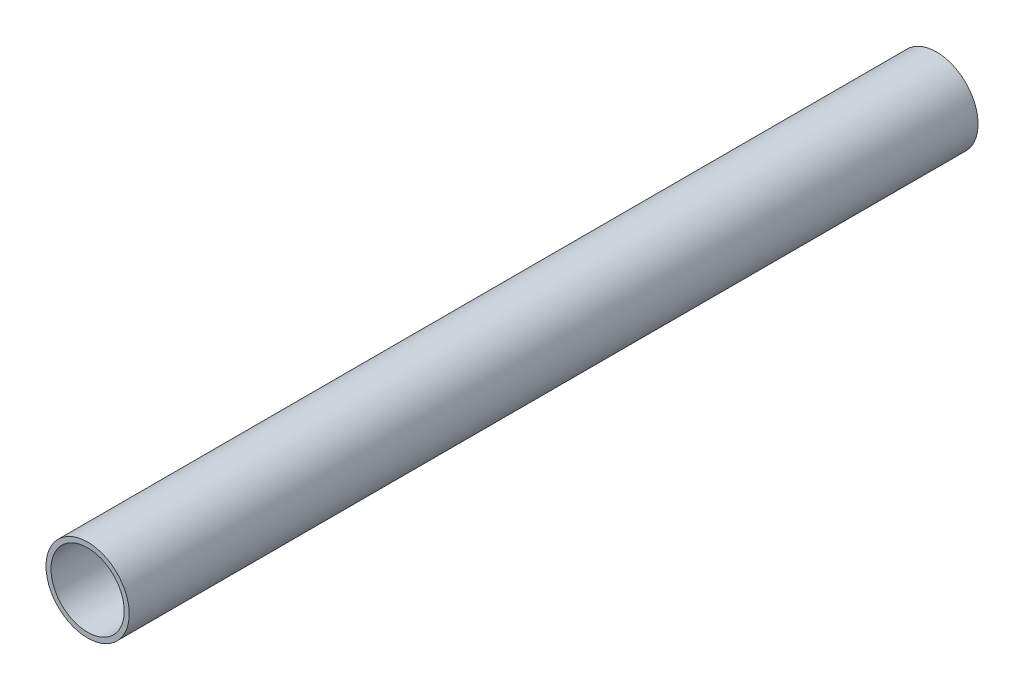
ISO-10303-21;
HEADER;
FILE_DESCRIPTION(('STEP AP214'),'2;1');
FILE_NAME('part.step','',(''),(''),'','','');
FILE_SCHEMA(('AUTOMOTIVE_DESIGN { 1 0 10303 214 1 1 1 1 }'));
ENDSEC;
DATA;
#1=APPLICATION_CONTEXT('core data for automotive mechanical design processes');
#2=APPLICATION_PROTOCOL_DEFINITION('international standard','automotive_design',2000,#1);
#3=PRODUCT_CONTEXT('',#1,'mechanical');
#4=PRODUCT('Part','Part','',(#3));
#5=PRODUCT_RELATED_PRODUCT_CATEGORY('part','',(#4));
#6=PRODUCT_DEFINITION_FORMATION('','',#4);
#7=PRODUCT_DEFINITION_CONTEXT('part definition',#1,'design');
#8=PRODUCT_DEFINITION('design','',#6,#7);
#9=PRODUCT_DEFINITION_SHAPE('','',#8);
#10=(LENGTH_UNIT() NAMED_UNIT(*) SI_UNIT(.MILLI.,.METRE.));
#11=(NAMED_UNIT(*) PLANE_ANGLE_UNIT() SI_UNIT($,.RADIAN.));
#12=(NAMED_UNIT(*) SI_UNIT($,.STERADIAN.) SOLID_ANGLE_UNIT());
#13=UNCERTAINTY_MEASURE_WITH_UNIT(LENGTH_MEASURE(1.E-05),#10,'distance_accuracy_value','');
#14=(GEOMETRIC_REPRESENTATION_CONTEXT(3) GLOBAL_UNCERTAINTY_ASSIGNED_CONTEXT((#13)) GLOBAL_UNIT_ASSIGNED_CONTEXT((#10,
#11,#12)) REPRESENTATION_CONTEXT('',''));
#15=CARTESIAN_POINT('',(0.,0.,0.));
#16=DIRECTION('',(0.,0.,1.));
#17=DIRECTION('',(1.,0.,0.));
#18=AXIS2_PLACEMENT_3D('',#15,#16,#17);
#19=CARTESIAN_POINT('',(0.,0.,235.43));
#20=DIRECTION('',(0.,0.,-1.));
#21=DIRECTION('',(-1.,0.,0.));
#22=AXIS2_PLACEMENT_3D('',#19,#20,#21);
#23=CYLINDRICAL_SURFACE('',#22,12.5);
#24=CARTESIAN_POINT('',(0.,0.,235.43));
#25=DIRECTION('',(0.,0.,1.));
#26=DIRECTION('',(1.,0.,0.));
#27=AXIS2_PLACEMENT_3D('',#24,#25,#26);
#28=CIRCLE('',#27,12.5);
#29=CARTESIAN_POINT('',(12.5,0.,235.43));
#30=VERTEX_POINT('',#29);
#31=EDGE_CURVE('E10',#30,#30,#28,.T.);
#32=ORIENTED_EDGE('',*,*,#31,.F.);
#33=EDGE_LOOP('',(#32));
#34=FACE_BOUND('',#33,.T.);
#35=CARTESIAN_POINT('',(0.,0.,-19.57));
#36=DIRECTION('',(0.,0.,-1.));
#37=DIRECTION('',(-1.,0.,0.));
#38=AXIS2_PLACEMENT_3D('',#35,#36,#37);
#39=CIRCLE('',#38,12.5);
#40=CARTESIAN_POINT('',(-12.5,0.,-19.57));
#41=VERTEX_POINT('',#40);
#42=EDGE_CURVE('E42',#41,#41,#39,.T.);
#43=ORIENTED_EDGE('',*,*,#42,.F.);
#44=EDGE_LOOP('',(#43));
#45=FACE_BOUND('',#44,.T.);
#46=ADVANCED_FACE('F36',(#34,#45),#23,.T.);
#47=CARTESIAN_POINT('',(0.,0.,235.43));
#48=DIRECTION('',(0.,0.,1.));
#49=DIRECTION('',(1.,0.,0.));
#50=AXIS2_PLACEMENT_3D('',#47,#48,#49);
#51=PLANE('',#50);
#52=CARTESIAN_POINT('',(0.,0.,235.43));
#53=DIRECTION('',(0.,0.,1.));
#54=DIRECTION('',(1.,0.,0.));
#55=AXIS2_PLACEMENT_3D('',#52,#53,#54);
#56=CIRCLE('',#55,11.);
#57=CARTESIAN_POINT('',(-11.,0.,235.43));
#58=VERTEX_POINT('',#57);
#59=EDGE_CURVE('E46',#58,#58,#56,.T.);
#60=ORIENTED_EDGE('',*,*,#59,.F.);
#61=EDGE_LOOP('',(#60));
#62=FACE_BOUND('',#61,.T.);
#63=ORIENTED_EDGE('',*,*,#31,.T.);
#64=EDGE_LOOP('',(#63));
#65=FACE_BOUND('',#64,.T.);
#66=ADVANCED_FACE('F60',(#62,#65),#51,.T.);
#67=CARTESIAN_POINT('',(1.22546035237292,2.32941642090623,-19.57));
#68=DIRECTION('',(0.,0.,-1.));
#69=DIRECTION('',(-1.,0.,0.));
#70=AXIS2_PLACEMENT_3D('',#67,#68,#69);
#71=PLANE('',#70);
#72=CARTESIAN_POINT('',(0.,0.,-19.57));
#73=DIRECTION('',(0.,0.,-1.));
#74=DIRECTION('',(-1.,0.,0.));
#75=AXIS2_PLACEMENT_3D('',#72,#73,#74);
#76=CIRCLE('',#75,11.);
#77=CARTESIAN_POINT('',(-11.,0.,-19.57));
#78=VERTEX_POINT('',#77);
#79=EDGE_CURVE('E50',#78,#78,#76,.T.);
#80=ORIENTED_EDGE('',*,*,#79,.F.);
#81=EDGE_LOOP('',(#80));
#82=FACE_BOUND('',#81,.T.);
#83=ORIENTED_EDGE('',*,*,#42,.T.);
#84=EDGE_LOOP('',(#83));
#85=FACE_BOUND('',#84,.T.);
#86=ADVANCED_FACE('F58',(#82,#85),#71,.T.);
#87=CARTESIAN_POINT('',(0.,0.,318.43));
#88=DIRECTION('',(0.,0.,-1.));
#89=DIRECTION('',(-1.,0.,0.));
#90=AXIS2_PLACEMENT_3D('',#87,#88,#89);
#91=CYLINDRICAL_SURFACE('',#90,11.);
#92=CARTESIAN_POINT('',(-11.,0.,235.43));
#93=CARTESIAN_POINT('',(-11.,0.,232.77375));
#94=CARTESIAN_POINT('',(-11.,0.,230.1175));
#95=CARTESIAN_POINT('',(-11.,0.,224.805));
#96=CARTESIAN_POINT('',(-11.,0.,222.14875));
#97=CARTESIAN_POINT('',(-11.,0.,216.83625));
#98=CARTESIAN_POINT('',(-11.,0.,214.18));
#99=CARTESIAN_POINT('',(-11.,0.,208.8675));
#100=CARTESIAN_POINT('',(-11.,0.,206.21125));
#101=CARTESIAN_POINT('',(-11.,0.,200.89875));
#102=CARTESIAN_POINT('',(-11.,0.,198.2425));
#103=CARTESIAN_POINT('',(-11.,0.,192.93));
#104=CARTESIAN_POINT('',(-11.,0.,190.27375));
#105=CARTESIAN_POINT('',(-11.,0.,184.96125));
#106=CARTESIAN_POINT('',(-11.,0.,182.305));
#107=CARTESIAN_POINT('',(-11.,0.,176.9925));
#108=CARTESIAN_POINT('',(-11.,0.,174.33625));
#109=CARTESIAN_POINT('',(-11.,0.,169.02375));
#110=CARTESIAN_POINT('',(-11.,0.,166.3675));
#111=CARTESIAN_POINT('',(-11.,0.,161.055));
#112=CARTESIAN_POINT('',(-11.,0.,158.39875));
#113=CARTESIAN_POINT('',(-11.,0.,153.08625));
#114=CARTESIAN_POINT('',(-11.,0.,150.43));
#115=CARTESIAN_POINT('',(-11.,0.,145.1175));
#116=CARTESIAN_POINT('',(-11.,0.,142.46125));
#117=CARTESIAN_POINT('',(-11.,0.,137.14875));
#118=CARTESIAN_POINT('',(-11.,0.,134.4925));
#119=CARTESIAN_POINT('',(-11.,0.,129.18));
#120=CARTESIAN_POINT('',(-11.,0.,126.52375));
#121=CARTESIAN_POINT('',(-11.,0.,121.21125));
#122=CARTESIAN_POINT('',(-11.,0.,118.555));
#123=CARTESIAN_POINT('',(-11.,0.,113.2425));
#124=CARTESIAN_POINT('',(-11.,0.,110.58625));
#125=CARTESIAN_POINT('',(-11.,0.,105.27375));
#126=CARTESIAN_POINT('',(-11.,0.,102.6175));
#127=CARTESIAN_POINT('',(-11.,0.,97.305));
#128=CARTESIAN_POINT('',(-11.,0.,94.64875));
#129=CARTESIAN_POINT('',(-11.,0.,89.33625));
#130=CARTESIAN_POINT('',(-11.,0.,86.68));
#131=CARTESIAN_POINT('',(-11.,0.,81.3674999999999));
#132=CARTESIAN_POINT('',(-11.,0.,78.7112499999999));
#133=CARTESIAN_POINT('',(-11.,0.,73.3987499999999));
#134=CARTESIAN_POINT('',(-11.,0.,70.7425));
#135=CARTESIAN_POINT('',(-11.,0.,65.43));
#136=CARTESIAN_POINT('',(-11.,0.,62.77375));
#137=CARTESIAN_POINT('',(-11.,0.,57.46125));
#138=CARTESIAN_POINT('',(-11.,0.,54.805));
#139=CARTESIAN_POINT('',(-11.,0.,49.4925));
#140=CARTESIAN_POINT('',(-11.,0.,46.83625));
#141=CARTESIAN_POINT('',(-11.,0.,41.52375));
#142=CARTESIAN_POINT('',(-11.,0.,38.8675));
#143=CARTESIAN_POINT('',(-11.,0.,33.555));
#144=CARTESIAN_POINT('',(-11.,0.,30.89875));
#145=CARTESIAN_POINT('',(-11.,0.,25.58625));
#146=CARTESIAN_POINT('',(-11.,0.,22.93));
#147=CARTESIAN_POINT('',(-11.,0.,17.6175));
#148=CARTESIAN_POINT('',(-11.,0.,14.96125));
#149=CARTESIAN_POINT('',(-11.,0.,9.64874999999996));
#150=CARTESIAN_POINT('',(-11.,0.,6.99249999999998));
#151=CARTESIAN_POINT('',(-11.,0.,1.67999999999998));
#152=CARTESIAN_POINT('',(-11.,0.,-0.97625000000003));
#153=CARTESIAN_POINT('',(-11.,0.,-6.28875000000005));
#154=CARTESIAN_POINT('',(-11.,0.,-8.94500000000006));
#155=CARTESIAN_POINT('',(-11.,0.,-14.2575000000001));
#156=CARTESIAN_POINT('',(-11.,0.,-16.91375));
#157=CARTESIAN_POINT('',(-11.,0.,-19.57));
#158=B_SPLINE_CURVE_WITH_KNOTS('',3,(#92,#93,#94,#95,#96,#97,#98,#99,#100,#101,#102,#103,#104,
#105,#106,#107,#108,#109,#110,#111,#112,#113,#114,#115,#116,#117,#118,#119,#120,#121,#122,#123,
#124,#125,#126,#127,#128,#129,#130,#131,#132,#133,#134,#135,#136,#137,#138,#139,#140,#141,#142,
#143,#144,#145,#146,#147,#148,#149,#150,#151,#152,#153,#154,#155,#156,#157),.UNSPECIFIED.,.F.,
.F.,(4,2,2,2,2,2,2,2,2,2,2,2,2,2,2,2,2,2,2,2,2,2,2,2,2,2,2,2,2,2,2,2,4),(0.,7.96874999999997,
15.9375,23.90625,31.875,39.84375,47.8125,55.78125,63.75,71.71875,79.6875,87.65625,95.625,
103.59375,111.5625,119.53125,127.5,135.46875,143.4375,151.40625,159.375,167.34375,175.3125,
183.28125,191.25,199.21875,207.1875,215.15625,223.125,231.09375,239.0625,247.03125,255.),.UNSPECIFIED.);
#159=EDGE_CURVE('BSEAM56',#58,#78,#158,.T.);
#160=ORIENTED_EDGE('',*,*,#59,.T.);
#161=ORIENTED_EDGE('',*,*,#79,.T.);
#162=ORIENTED_EDGE('',*,*,#159,.T.);
#163=ORIENTED_EDGE('',*,*,#159,.F.);
#164=EDGE_LOOP('',(#160,#162,#161,#163));
#165=FACE_BOUND('',#164,.T.);
#166=ADVANCED_FACE('F56',(#165),#91,.F.);
#167=CLOSED_SHELL('',(#46,#66,#86,#166));
#168=MANIFOLD_SOLID_BREP('B2',#167);
#169=ADVANCED_BREP_SHAPE_REPRESENTATION('',(#18,#168),#14);
#170=SHAPE_DEFINITION_REPRESENTATION(#9,#169);
ENDSEC;
END-ISO-10303-21;
